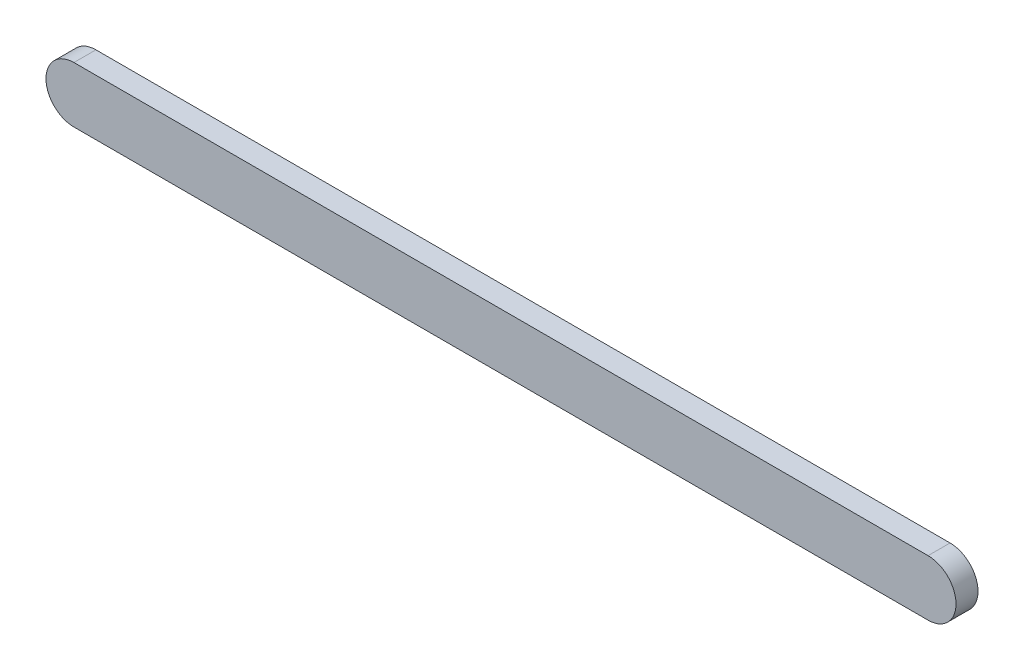
ISO-10303-21;
HEADER;
FILE_DESCRIPTION(('STEP AP214'),'2;1');
FILE_NAME('part.step','',(''),(''),'','','');
FILE_SCHEMA(('AUTOMOTIVE_DESIGN { 1 0 10303 214 1 1 1 1 }'));
ENDSEC;
DATA;
#1=APPLICATION_CONTEXT('core data for automotive mechanical design processes');
#2=APPLICATION_PROTOCOL_DEFINITION('international standard','automotive_design',2000,#1);
#3=PRODUCT_CONTEXT('',#1,'mechanical');
#4=PRODUCT('Part','Part','',(#3));
#5=PRODUCT_RELATED_PRODUCT_CATEGORY('part','',(#4));
#6=PRODUCT_DEFINITION_FORMATION('','',#4);
#7=PRODUCT_DEFINITION_CONTEXT('part definition',#1,'design');
#8=PRODUCT_DEFINITION('design','',#6,#7);
#9=PRODUCT_DEFINITION_SHAPE('','',#8);
#10=(LENGTH_UNIT() NAMED_UNIT(*) SI_UNIT(.MILLI.,.METRE.));
#11=(NAMED_UNIT(*) PLANE_ANGLE_UNIT() SI_UNIT($,.RADIAN.));
#12=(NAMED_UNIT(*) SI_UNIT($,.STERADIAN.) SOLID_ANGLE_UNIT());
#13=UNCERTAINTY_MEASURE_WITH_UNIT(LENGTH_MEASURE(1.E-05),#10,'distance_accuracy_value','');
#14=(GEOMETRIC_REPRESENTATION_CONTEXT(3) GLOBAL_UNCERTAINTY_ASSIGNED_CONTEXT((#13)) GLOBAL_UNIT_ASSIGNED_CONTEXT((#10,
#11,#12)) REPRESENTATION_CONTEXT('',''));
#15=CARTESIAN_POINT('',(0.,0.,0.));
#16=DIRECTION('',(0.,0.,1.));
#17=DIRECTION('',(1.,0.,0.));
#18=AXIS2_PLACEMENT_3D('',#15,#16,#17);
#19=CARTESIAN_POINT('',(109.4232,120.904,0.));
#20=DIRECTION('',(0.,1.,0.));
#21=DIRECTION('',(1.,0.,0.));
#22=AXIS2_PLACEMENT_3D('',#19,#20,#21);
#23=PLANE('',#22);
#24=DIRECTION('',(1.,0.,0.));
#25=VECTOR('',#24,1.);
#26=CARTESIAN_POINT('',(109.4232,120.904,0.1999996));
#27=LINE('',#26,#25);
#28=CARTESIAN_POINT('',(109.4232,120.904,0.1999996));
#29=VERTEX_POINT('',#28);
#30=CARTESIAN_POINT('',(117.188488,120.904,0.1999996));
#31=VERTEX_POINT('',#30);
#32=EDGE_CURVE('E11',#29,#31,#27,.T.);
#33=ORIENTED_EDGE('',*,*,#32,.F.);
#34=DIRECTION('',(0.,0.,1.));
#35=VECTOR('',#34,1.);
#36=CARTESIAN_POINT('',(109.4232,120.904,0.));
#37=LINE('',#36,#35);
#38=CARTESIAN_POINT('',(109.4232,120.904,0.));
#39=VERTEX_POINT('',#38);
#40=EDGE_CURVE('E24',#39,#29,#37,.T.);
#41=ORIENTED_EDGE('',*,*,#40,.F.);
#42=DIRECTION('',(1.,0.,0.));
#43=VECTOR('',#42,1.);
#44=CARTESIAN_POINT('',(109.4232,120.904,0.));
#45=LINE('',#44,#43);
#46=CARTESIAN_POINT('',(117.188488,120.904,0.));
#47=VERTEX_POINT('',#46);
#48=EDGE_CURVE('E75',#39,#47,#45,.T.);
#49=ORIENTED_EDGE('',*,*,#48,.T.);
#50=DIRECTION('',(0.,0.,1.));
#51=VECTOR('',#50,1.);
#52=CARTESIAN_POINT('',(117.188488,120.904,0.));
#53=LINE('',#52,#51);
#54=EDGE_CURVE('E37',#47,#31,#53,.T.);
#55=ORIENTED_EDGE('',*,*,#54,.T.);
#56=EDGE_LOOP('',(#33,#41,#49,#55));
#57=FACE_BOUND('',#56,.T.);
#58=ADVANCED_FACE('F17',(#57),#23,.F.);
#59=CARTESIAN_POINT('',(117.188488,121.158,0.));
#60=DIRECTION('',(0.,0.,-1.));
#61=DIRECTION('',(0.,-1.,0.));
#62=AXIS2_PLACEMENT_3D('',#59,#60,#61);
#63=CYLINDRICAL_SURFACE('',#62,0.254000000000005);
#64=CARTESIAN_POINT('',(117.188488,121.158,0.1999996));
#65=DIRECTION('',(0.,0.,1.));
#66=DIRECTION('',(0.,-1.,0.));
#67=AXIS2_PLACEMENT_3D('',#64,#65,#66);
#68=CIRCLE('',#67,0.254000000000005);
#69=CARTESIAN_POINT('',(117.188488,121.412,0.1999996));
#70=VERTEX_POINT('',#69);
#71=EDGE_CURVE('E83',#31,#70,#68,.T.);
#72=ORIENTED_EDGE('',*,*,#71,.F.);
#73=ORIENTED_EDGE('',*,*,#54,.F.);
#74=CARTESIAN_POINT('',(117.188488,121.158,0.));
#75=DIRECTION('',(0.,0.,1.));
#76=DIRECTION('',(0.,-1.,0.));
#77=AXIS2_PLACEMENT_3D('',#74,#75,#76);
#78=CIRCLE('',#77,0.254000000000005);
#79=CARTESIAN_POINT('',(117.188488,121.412,0.));
#80=VERTEX_POINT('',#79);
#81=EDGE_CURVE('E81',#47,#80,#78,.T.);
#82=ORIENTED_EDGE('',*,*,#81,.T.);
#83=DIRECTION('',(0.,0.,1.));
#84=VECTOR('',#83,1.);
#85=CARTESIAN_POINT('',(117.188488,121.412,0.));
#86=LINE('',#85,#84);
#87=EDGE_CURVE('E67',#80,#70,#86,.T.);
#88=ORIENTED_EDGE('',*,*,#87,.T.);
#89=EDGE_LOOP('',(#72,#73,#82,#88));
#90=FACE_BOUND('',#89,.T.);
#91=ADVANCED_FACE('F89',(#90),#63,.T.);
#92=CARTESIAN_POINT('',(117.188488,121.412,0.));
#93=DIRECTION('',(0.,-1.,0.));
#94=DIRECTION('',(-1.,0.,0.));
#95=AXIS2_PLACEMENT_3D('',#92,#93,#94);
#96=PLANE('',#95);
#97=DIRECTION('',(-1.,0.,0.));
#98=VECTOR('',#97,1.);
#99=CARTESIAN_POINT('',(117.188488,121.412,0.1999996));
#100=LINE('',#99,#98);
#101=CARTESIAN_POINT('',(109.4232,121.412,0.1999996));
#102=VERTEX_POINT('',#101);
#103=EDGE_CURVE('E71',#70,#102,#100,.T.);
#104=ORIENTED_EDGE('',*,*,#103,.F.);
#105=ORIENTED_EDGE('',*,*,#87,.F.);
#106=DIRECTION('',(-1.,0.,0.));
#107=VECTOR('',#106,1.);
#108=CARTESIAN_POINT('',(117.188488,121.412,0.));
#109=LINE('',#108,#107);
#110=CARTESIAN_POINT('',(109.4232,121.412,0.));
#111=VERTEX_POINT('',#110);
#112=EDGE_CURVE('E63',#80,#111,#109,.T.);
#113=ORIENTED_EDGE('',*,*,#112,.T.);
#114=DIRECTION('',(0.,0.,1.));
#115=VECTOR('',#114,1.);
#116=CARTESIAN_POINT('',(109.4232,121.412,0.));
#117=LINE('',#116,#115);
#118=EDGE_CURVE('E53',#111,#102,#117,.T.);
#119=ORIENTED_EDGE('',*,*,#118,.T.);
#120=EDGE_LOOP('',(#104,#105,#113,#119));
#121=FACE_BOUND('',#120,.T.);
#122=ADVANCED_FACE('F66',(#121),#96,.F.);
#123=CARTESIAN_POINT('',(109.4232,121.158,0.));
#124=DIRECTION('',(0.,0.,-1.));
#125=DIRECTION('',(0.,1.,0.));
#126=AXIS2_PLACEMENT_3D('',#123,#124,#125);
#127=CYLINDRICAL_SURFACE('',#126,0.254000000000005);
#128=CARTESIAN_POINT('',(109.4232,121.158,0.1999996));
#129=DIRECTION('',(0.,0.,1.));
#130=DIRECTION('',(0.,1.,0.));
#131=AXIS2_PLACEMENT_3D('',#128,#129,#130);
#132=CIRCLE('',#131,0.254000000000005);
#133=EDGE_CURVE('E59',#102,#29,#132,.T.);
#134=ORIENTED_EDGE('',*,*,#133,.F.);
#135=ORIENTED_EDGE('',*,*,#118,.F.);
#136=CARTESIAN_POINT('',(109.4232,121.158,0.));
#137=DIRECTION('',(0.,0.,1.));
#138=DIRECTION('',(0.,1.,0.));
#139=AXIS2_PLACEMENT_3D('',#136,#137,#138);
#140=CIRCLE('',#139,0.254000000000005);
#141=EDGE_CURVE('E57',#111,#39,#140,.T.);
#142=ORIENTED_EDGE('',*,*,#141,.T.);
#143=ORIENTED_EDGE('',*,*,#40,.T.);
#144=EDGE_LOOP('',(#134,#135,#142,#143));
#145=FACE_BOUND('',#144,.T.);
#146=ADVANCED_FACE('F55',(#145),#127,.T.);
#147=CARTESIAN_POINT('',(109.4232,120.904,0.));
#148=DIRECTION('',(0.,0.,-1.));
#149=DIRECTION('',(-1.,0.,0.));
#150=AXIS2_PLACEMENT_3D('',#147,#148,#149);
#151=PLANE('',#150);
#152=ORIENTED_EDGE('',*,*,#141,.F.);
#153=ORIENTED_EDGE('',*,*,#112,.F.);
#154=ORIENTED_EDGE('',*,*,#81,.F.);
#155=ORIENTED_EDGE('',*,*,#48,.F.);
#156=EDGE_LOOP('',(#152,#153,#154,#155));
#157=FACE_BOUND('',#156,.T.);
#158=ADVANCED_FACE('F74',(#157),#151,.T.);
#159=CARTESIAN_POINT('',(109.4232,120.904,0.1999996));
#160=DIRECTION('',(0.,0.,-1.));
#161=DIRECTION('',(-1.,0.,0.));
#162=AXIS2_PLACEMENT_3D('',#159,#160,#161);
#163=PLANE('',#162);
#164=ORIENTED_EDGE('',*,*,#32,.T.);
#165=ORIENTED_EDGE('',*,*,#71,.T.);
#166=ORIENTED_EDGE('',*,*,#103,.T.);
#167=ORIENTED_EDGE('',*,*,#133,.T.);
#168=EDGE_LOOP('',(#164,#165,#166,#167));
#169=FACE_BOUND('',#168,.T.);
#170=ADVANCED_FACE('F91',(#169),#163,.F.);
#171=CLOSED_SHELL('',(#58,#91,#122,#146,#158,#170));
#172=MANIFOLD_SOLID_BREP('B1',#171);
#173=ADVANCED_BREP_SHAPE_REPRESENTATION('',(#18,#172),#14);
#174=SHAPE_DEFINITION_REPRESENTATION(#9,#173);
ENDSEC;
END-ISO-10303-21;
